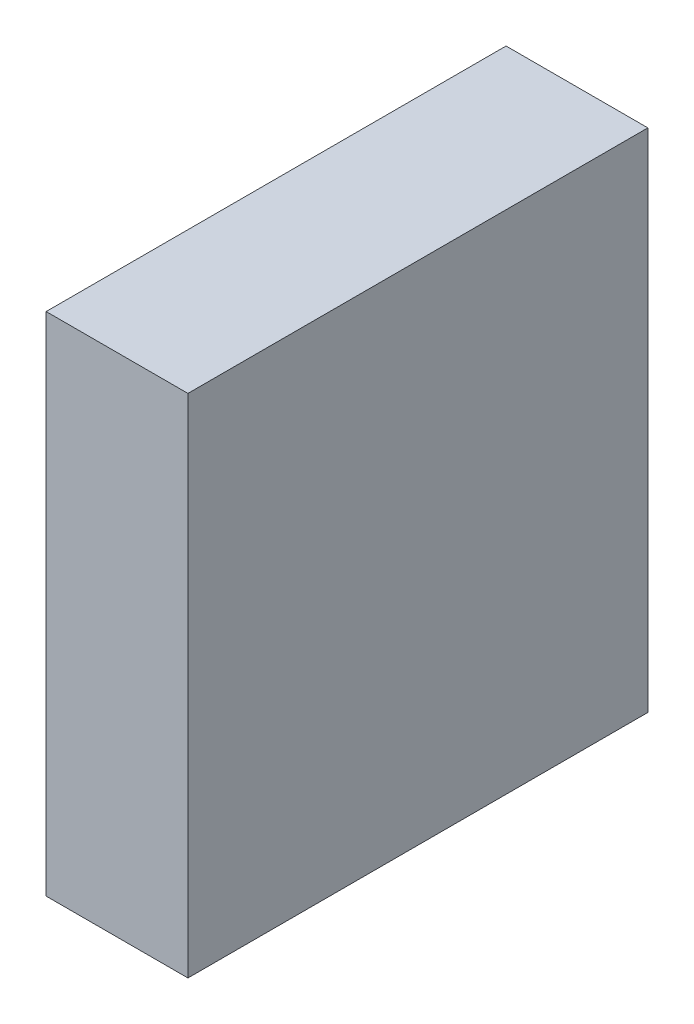
ISO-10303-21;
HEADER;
FILE_DESCRIPTION(('STEP AP214'),'2;1');
FILE_NAME('part.step','',(''),(''),'','','');
FILE_SCHEMA(('AUTOMOTIVE_DESIGN { 1 0 10303 214 1 1 1 1 }'));
ENDSEC;
DATA;
#1=APPLICATION_CONTEXT('core data for automotive mechanical design processes');
#2=APPLICATION_PROTOCOL_DEFINITION('international standard','automotive_design',2000,#1);
#3=PRODUCT_CONTEXT('',#1,'mechanical');
#4=PRODUCT('Part','Part','',(#3));
#5=PRODUCT_RELATED_PRODUCT_CATEGORY('part','',(#4));
#6=PRODUCT_DEFINITION_FORMATION('','',#4);
#7=PRODUCT_DEFINITION_CONTEXT('part definition',#1,'design');
#8=PRODUCT_DEFINITION('design','',#6,#7);
#9=PRODUCT_DEFINITION_SHAPE('','',#8);
#10=(LENGTH_UNIT() NAMED_UNIT(*) SI_UNIT(.MILLI.,.METRE.));
#11=(NAMED_UNIT(*) PLANE_ANGLE_UNIT() SI_UNIT($,.RADIAN.));
#12=(NAMED_UNIT(*) SI_UNIT($,.STERADIAN.) SOLID_ANGLE_UNIT());
#13=UNCERTAINTY_MEASURE_WITH_UNIT(LENGTH_MEASURE(1.E-05),#10,'distance_accuracy_value','');
#14=(GEOMETRIC_REPRESENTATION_CONTEXT(3) GLOBAL_UNCERTAINTY_ASSIGNED_CONTEXT((#13)) GLOBAL_UNIT_ASSIGNED_CONTEXT((#10,
#11,#12)) REPRESENTATION_CONTEXT('',''));
#15=CARTESIAN_POINT('',(0.,0.,0.));
#16=DIRECTION('',(0.,0.,1.));
#17=DIRECTION('',(1.,0.,0.));
#18=AXIS2_PLACEMENT_3D('',#15,#16,#17);
#19=CARTESIAN_POINT('',(0.,70.739,0.));
#20=DIRECTION('',(1.,0.,0.));
#21=DIRECTION('',(0.,0.,-1.));
#22=AXIS2_PLACEMENT_3D('',#19,#20,#21);
#23=PLANE('',#22);
#24=DIRECTION('',(0.,0.,1.));
#25=VECTOR('',#24,1.);
#26=CARTESIAN_POINT('',(0.,0.,0.));
#27=LINE('',#26,#25);
#28=CARTESIAN_POINT('',(0.,0.,-64.262));
#29=VERTEX_POINT('',#28);
#30=CARTESIAN_POINT('',(0.,0.,0.));
#31=VERTEX_POINT('',#30);
#32=EDGE_CURVE('E96',#29,#31,#27,.T.);
#33=ORIENTED_EDGE('',*,*,#32,.T.);
#34=DIRECTION('',(0.,-1.,0.));
#35=VECTOR('',#34,1.);
#36=CARTESIAN_POINT('',(0.,70.739,0.));
#37=LINE('',#36,#35);
#38=CARTESIAN_POINT('',(0.,70.739,0.));
#39=VERTEX_POINT('',#38);
#40=EDGE_CURVE('E11',#39,#31,#37,.T.);
#41=ORIENTED_EDGE('',*,*,#40,.F.);
#42=DIRECTION('',(0.,0.,1.));
#43=VECTOR('',#42,1.);
#44=CARTESIAN_POINT('',(0.,70.739,0.));
#45=LINE('',#44,#43);
#46=CARTESIAN_POINT('',(0.,70.739,-64.262));
#47=VERTEX_POINT('',#46);
#48=EDGE_CURVE('E84',#47,#39,#45,.T.);
#49=ORIENTED_EDGE('',*,*,#48,.F.);
#50=DIRECTION('',(0.,-1.,0.));
#51=VECTOR('',#50,1.);
#52=CARTESIAN_POINT('',(0.,70.739,-64.262));
#53=LINE('',#52,#51);
#54=EDGE_CURVE('E92',#47,#29,#53,.T.);
#55=ORIENTED_EDGE('',*,*,#54,.T.);
#56=EDGE_LOOP('',(#33,#41,#49,#55));
#57=FACE_BOUND('',#56,.T.);
#58=ADVANCED_FACE('F33',(#57),#23,.F.);
#59=CARTESIAN_POINT('',(0.,70.739,0.));
#60=DIRECTION('',(0.,0.,-1.));
#61=DIRECTION('',(-1.,0.,0.));
#62=AXIS2_PLACEMENT_3D('',#59,#60,#61);
#63=PLANE('',#62);
#64=DIRECTION('',(1.,0.,0.));
#65=VECTOR('',#64,1.);
#66=CARTESIAN_POINT('',(0.,0.,0.));
#67=LINE('',#66,#65);
#68=CARTESIAN_POINT('',(19.812,0.,0.));
#69=VERTEX_POINT('',#68);
#70=EDGE_CURVE('E88',#31,#69,#67,.T.);
#71=ORIENTED_EDGE('',*,*,#70,.T.);
#72=DIRECTION('',(0.,-1.,0.));
#73=VECTOR('',#72,1.);
#74=CARTESIAN_POINT('',(19.812,70.739,0.));
#75=LINE('',#74,#73);
#76=CARTESIAN_POINT('',(19.812,70.739,0.));
#77=VERTEX_POINT('',#76);
#78=EDGE_CURVE('E41',#77,#69,#75,.T.);
#79=ORIENTED_EDGE('',*,*,#78,.F.);
#80=DIRECTION('',(1.,0.,0.));
#81=VECTOR('',#80,1.);
#82=CARTESIAN_POINT('',(0.,70.739,0.));
#83=LINE('',#82,#81);
#84=EDGE_CURVE('E79',#39,#77,#83,.T.);
#85=ORIENTED_EDGE('',*,*,#84,.F.);
#86=ORIENTED_EDGE('',*,*,#40,.T.);
#87=EDGE_LOOP('',(#71,#79,#85,#86));
#88=FACE_BOUND('',#87,.T.);
#89=ADVANCED_FACE('F87',(#88),#63,.F.);
#90=CARTESIAN_POINT('',(19.812,70.739,0.));
#91=DIRECTION('',(-1.,0.,0.));
#92=DIRECTION('',(0.,0.,1.));
#93=AXIS2_PLACEMENT_3D('',#90,#91,#92);
#94=PLANE('',#93);
#95=DIRECTION('',(0.,0.,-1.));
#96=VECTOR('',#95,1.);
#97=CARTESIAN_POINT('',(19.812,0.,0.));
#98=LINE('',#97,#96);
#99=CARTESIAN_POINT('',(19.812,0.,-64.262));
#100=VERTEX_POINT('',#99);
#101=EDGE_CURVE('E66',#69,#100,#98,.T.);
#102=ORIENTED_EDGE('',*,*,#101,.T.);
#103=DIRECTION('',(0.,-1.,0.));
#104=VECTOR('',#103,1.);
#105=CARTESIAN_POINT('',(19.812,70.739,-64.262));
#106=LINE('',#105,#104);
#107=CARTESIAN_POINT('',(19.812,70.739,-64.262));
#108=VERTEX_POINT('',#107);
#109=EDGE_CURVE('E89',#108,#100,#106,.T.);
#110=ORIENTED_EDGE('',*,*,#109,.F.);
#111=DIRECTION('',(0.,0.,-1.));
#112=VECTOR('',#111,1.);
#113=CARTESIAN_POINT('',(19.812,70.739,0.));
#114=LINE('',#113,#112);
#115=EDGE_CURVE('E82',#77,#108,#114,.T.);
#116=ORIENTED_EDGE('',*,*,#115,.F.);
#117=ORIENTED_EDGE('',*,*,#78,.T.);
#118=EDGE_LOOP('',(#102,#110,#116,#117));
#119=FACE_BOUND('',#118,.T.);
#120=ADVANCED_FACE('F90',(#119),#94,.F.);
#121=CARTESIAN_POINT('',(0.,70.739,-64.262));
#122=DIRECTION('',(0.,0.,1.));
#123=DIRECTION('',(1.,0.,0.));
#124=AXIS2_PLACEMENT_3D('',#121,#122,#123);
#125=PLANE('',#124);
#126=DIRECTION('',(-1.,0.,0.));
#127=VECTOR('',#126,1.);
#128=CARTESIAN_POINT('',(0.,0.,-64.262));
#129=LINE('',#128,#127);
#130=EDGE_CURVE('E72',#100,#29,#129,.T.);
#131=ORIENTED_EDGE('',*,*,#130,.T.);
#132=ORIENTED_EDGE('',*,*,#54,.F.);
#133=DIRECTION('',(-1.,0.,0.));
#134=VECTOR('',#133,1.);
#135=CARTESIAN_POINT('',(0.,70.739,-64.262));
#136=LINE('',#135,#134);
#137=EDGE_CURVE('E49',#108,#47,#136,.T.);
#138=ORIENTED_EDGE('',*,*,#137,.F.);
#139=ORIENTED_EDGE('',*,*,#109,.T.);
#140=EDGE_LOOP('',(#131,#132,#138,#139));
#141=FACE_BOUND('',#140,.T.);
#142=ADVANCED_FACE('F103',(#141),#125,.F.);
#143=CARTESIAN_POINT('',(0.,70.739,0.));
#144=DIRECTION('',(0.,-1.,0.));
#145=DIRECTION('',(0.,0.,-1.));
#146=AXIS2_PLACEMENT_3D('',#143,#144,#145);
#147=PLANE('',#146);
#148=ORIENTED_EDGE('',*,*,#48,.T.);
#149=ORIENTED_EDGE('',*,*,#84,.T.);
#150=ORIENTED_EDGE('',*,*,#115,.T.);
#151=ORIENTED_EDGE('',*,*,#137,.T.);
#152=EDGE_LOOP('',(#148,#149,#150,#151));
#153=FACE_BOUND('',#152,.T.);
#154=ADVANCED_FACE('F80',(#153),#147,.F.);
#155=CARTESIAN_POINT('',(0.,0.,0.));
#156=DIRECTION('',(0.,-1.,0.));
#157=DIRECTION('',(0.,0.,-1.));
#158=AXIS2_PLACEMENT_3D('',#155,#156,#157);
#159=PLANE('',#158);
#160=ORIENTED_EDGE('',*,*,#32,.F.);
#161=ORIENTED_EDGE('',*,*,#130,.F.);
#162=ORIENTED_EDGE('',*,*,#101,.F.);
#163=ORIENTED_EDGE('',*,*,#70,.F.);
#164=EDGE_LOOP('',(#160,#161,#162,#163));
#165=FACE_BOUND('',#164,.T.);
#166=ADVANCED_FACE('F106',(#165),#159,.T.);
#167=CLOSED_SHELL('',(#58,#89,#120,#142,#154,#166));
#168=MANIFOLD_SOLID_BREP('B2',#167);
#169=ADVANCED_BREP_SHAPE_REPRESENTATION('',(#18,#168),#14);
#170=SHAPE_DEFINITION_REPRESENTATION(#9,#169);
ENDSEC;
END-ISO-10303-21;
